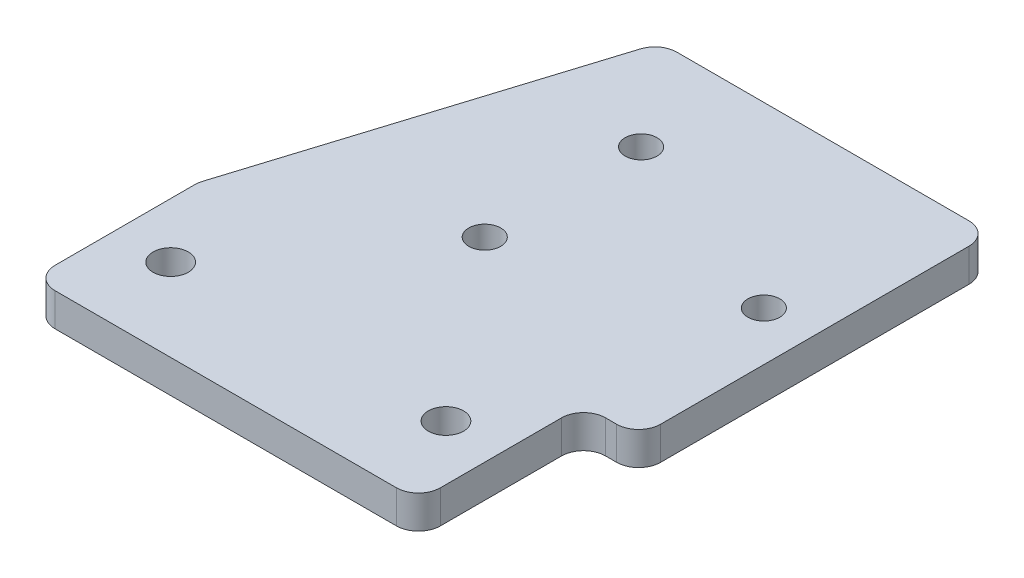
ISO-10303-21;
HEADER;
FILE_DESCRIPTION(('STEP AP214'),'2;1');
FILE_NAME('part.step','',(''),(''),'','','');
FILE_SCHEMA(('AUTOMOTIVE_DESIGN { 1 0 10303 214 1 1 1 1 }'));
ENDSEC;
DATA;
#1=APPLICATION_CONTEXT('core data for automotive mechanical design processes');
#2=APPLICATION_PROTOCOL_DEFINITION('international standard','automotive_design',2000,#1);
#3=PRODUCT_CONTEXT('',#1,'mechanical');
#4=PRODUCT('Part','Part','',(#3));
#5=PRODUCT_RELATED_PRODUCT_CATEGORY('part','',(#4));
#6=PRODUCT_DEFINITION_FORMATION('','',#4);
#7=PRODUCT_DEFINITION_CONTEXT('part definition',#1,'design');
#8=PRODUCT_DEFINITION('design','',#6,#7);
#9=PRODUCT_DEFINITION_SHAPE('','',#8);
#10=(LENGTH_UNIT() NAMED_UNIT(*) SI_UNIT(.MILLI.,.METRE.));
#11=(NAMED_UNIT(*) PLANE_ANGLE_UNIT() SI_UNIT($,.RADIAN.));
#12=(NAMED_UNIT(*) SI_UNIT($,.STERADIAN.) SOLID_ANGLE_UNIT());
#13=UNCERTAINTY_MEASURE_WITH_UNIT(LENGTH_MEASURE(1.E-05),#10,'distance_accuracy_value','');
#14=(GEOMETRIC_REPRESENTATION_CONTEXT(3) GLOBAL_UNCERTAINTY_ASSIGNED_CONTEXT((#13)) GLOBAL_UNIT_ASSIGNED_CONTEXT((#10,
#11,#12)) REPRESENTATION_CONTEXT('',''));
#15=CARTESIAN_POINT('',(0.,0.,0.));
#16=DIRECTION('',(0.,0.,1.));
#17=DIRECTION('',(1.,0.,0.));
#18=AXIS2_PLACEMENT_3D('',#15,#16,#17);
#19=CARTESIAN_POINT('',(0.,3.,0.));
#20=DIRECTION('',(0.,1.,0.));
#21=DIRECTION('',(0.,0.,1.));
#22=AXIS2_PLACEMENT_3D('',#19,#20,#21);
#23=PLANE('',#22);
#24=CARTESIAN_POINT('',(17.3015750443621,3.,-37.9242963081601));
#25=DIRECTION('',(0.,1.,0.));
#26=DIRECTION('',(0.,0.,1.));
#27=AXIS2_PLACEMENT_3D('',#24,#25,#26);
#28=CIRCLE('',#27,1.45);
#29=CARTESIAN_POINT('',(17.3015750443621,3.,-36.4742963081601));
#30=VERTEX_POINT('',#29);
#31=EDGE_CURVE('E332',#30,#30,#28,.T.);
#32=ORIENTED_EDGE('',*,*,#31,.F.);
#33=EDGE_LOOP('',(#32));
#34=FACE_BOUND('',#33,.T.);
#35=CARTESIAN_POINT('',(35.5515750443621,3.,-30.8242963081601));
#36=DIRECTION('',(0.,1.,0.));
#37=DIRECTION('',(0.,0.,1.));
#38=AXIS2_PLACEMENT_3D('',#35,#36,#37);
#39=CIRCLE('',#38,1.45);
#40=CARTESIAN_POINT('',(35.5515750443621,3.,-29.3742963081601));
#41=VERTEX_POINT('',#40);
#42=EDGE_CURVE('E320',#41,#41,#39,.T.);
#43=ORIENTED_EDGE('',*,*,#42,.F.);
#44=EDGE_LOOP('',(#43));
#45=FACE_BOUND('',#44,.T.);
#46=DIRECTION('',(0.,0.,1.));
#47=VECTOR('',#46,1.);
#48=CARTESIAN_POINT('',(0.,3.,0.));
#49=LINE('',#48,#47);
#50=CARTESIAN_POINT('',(0.,3.,-14.6947781543039));
#51=VERTEX_POINT('',#50);
#52=CARTESIAN_POINT('',(0.,3.,-2.));
#53=VERTEX_POINT('',#52);
#54=EDGE_CURVE('E255',#51,#53,#49,.T.);
#55=ORIENTED_EDGE('',*,*,#54,.T.);
#56=CARTESIAN_POINT('',(2.,3.,-2.));
#57=DIRECTION('',(0.,1.,0.));
#58=DIRECTION('',(0.,0.,1.));
#59=AXIS2_PLACEMENT_3D('',#56,#57,#58);
#60=CIRCLE('',#59,2.);
#61=CARTESIAN_POINT('',(2.,3.,0.));
#62=VERTEX_POINT('',#61);
#63=EDGE_CURVE('E200',#53,#62,#60,.T.);
#64=ORIENTED_EDGE('',*,*,#63,.T.);
#65=DIRECTION('',(1.,0.,0.));
#66=VECTOR('',#65,1.);
#67=CARTESIAN_POINT('',(35.,3.,0.));
#68=LINE('',#67,#66);
#69=CARTESIAN_POINT('',(33.,3.,0.));
#70=VERTEX_POINT('',#69);
#71=EDGE_CURVE('E162',#62,#70,#68,.T.);
#72=ORIENTED_EDGE('',*,*,#71,.T.);
#73=CARTESIAN_POINT('',(33.,3.,-2.));
#74=DIRECTION('',(0.,1.,0.));
#75=DIRECTION('',(0.,0.,1.));
#76=AXIS2_PLACEMENT_3D('',#73,#74,#75);
#77=CIRCLE('',#76,2.);
#78=CARTESIAN_POINT('',(35.,3.,-2.));
#79=VERTEX_POINT('',#78);
#80=EDGE_CURVE('E63',#70,#79,#77,.T.);
#81=ORIENTED_EDGE('',*,*,#80,.T.);
#82=DIRECTION('',(0.,0.,-1.));
#83=VECTOR('',#82,1.);
#84=CARTESIAN_POINT('',(35.,3.,-15.));
#85=LINE('',#84,#83);
#86=CARTESIAN_POINT('',(35.,3.,-13.));
#87=VERTEX_POINT('',#86);
#88=EDGE_CURVE('E178',#79,#87,#85,.T.);
#89=ORIENTED_EDGE('',*,*,#88,.T.);
#90=CARTESIAN_POINT('',(37.,3.,-13.));
#91=DIRECTION('',(0.,1.,0.));
#92=DIRECTION('',(0.,0.,1.));
#93=AXIS2_PLACEMENT_3D('',#90,#91,#92);
#94=CIRCLE('',#93,2.);
#95=CARTESIAN_POINT('',(37.,3.,-15.));
#96=VERTEX_POINT('',#95);
#97=EDGE_CURVE('E11',#87,#96,#94,.F.);
#98=ORIENTED_EDGE('',*,*,#97,.T.);
#99=DIRECTION('',(1.,0.,0.));
#100=VECTOR('',#99,1.);
#101=CARTESIAN_POINT('',(40.,3.,-15.));
#102=LINE('',#101,#100);
#103=CARTESIAN_POINT('',(38.,3.,-15.));
#104=VERTEX_POINT('',#103);
#105=EDGE_CURVE('E172',#96,#104,#102,.T.);
#106=ORIENTED_EDGE('',*,*,#105,.T.);
#107=CARTESIAN_POINT('',(38.,3.,-17.));
#108=DIRECTION('',(0.,1.,0.));
#109=DIRECTION('',(0.,0.,1.));
#110=AXIS2_PLACEMENT_3D('',#107,#108,#109);
#111=CIRCLE('',#110,2.);
#112=CARTESIAN_POINT('',(40.,3.,-17.));
#113=VERTEX_POINT('',#112);
#114=EDGE_CURVE('E192',#104,#113,#111,.T.);
#115=ORIENTED_EDGE('',*,*,#114,.T.);
#116=DIRECTION('',(0.,0.,-1.));
#117=VECTOR('',#116,1.);
#118=CARTESIAN_POINT('',(40.,3.,-47.));
#119=LINE('',#118,#117);
#120=CARTESIAN_POINT('',(40.,3.,-45.));
#121=VERTEX_POINT('',#120);
#122=EDGE_CURVE('E241',#113,#121,#119,.T.);
#123=ORIENTED_EDGE('',*,*,#122,.T.);
#124=CARTESIAN_POINT('',(38.,3.,-45.));
#125=DIRECTION('',(0.,1.,0.));
#126=DIRECTION('',(0.,0.,1.));
#127=AXIS2_PLACEMENT_3D('',#124,#125,#126);
#128=CIRCLE('',#127,2.);
#129=CARTESIAN_POINT('',(38.,3.,-47.));
#130=VERTEX_POINT('',#129);
#131=EDGE_CURVE('E194',#121,#130,#128,.T.);
#132=ORIENTED_EDGE('',*,*,#131,.T.);
#133=DIRECTION('',(-1.,0.,0.));
#134=VECTOR('',#133,1.);
#135=CARTESIAN_POINT('',(25.,3.,-47.));
#136=LINE('',#135,#134);
#137=CARTESIAN_POINT('',(11.47038182678,3.,-47.));
#138=VERTEX_POINT('',#137);
#139=EDGE_CURVE('E244',#130,#138,#136,.T.);
#140=ORIENTED_EDGE('',*,*,#139,.T.);
#141=CARTESIAN_POINT('',(11.47038182678,3.,-45.));
#142=DIRECTION('',(0.,1.,0.));
#143=DIRECTION('',(0.,0.,1.));
#144=AXIS2_PLACEMENT_3D('',#141,#142,#143);
#145=CIRCLE('',#144,2.);
#146=CARTESIAN_POINT('',(9.56142187070997,3.,-45.5965499862719));
#147=VERTEX_POINT('',#146);
#148=EDGE_CURVE('E196',#138,#147,#145,.T.);
#149=ORIENTED_EDGE('',*,*,#148,.T.);
#150=DIRECTION('',(-0.298274993135947,0.,0.95447997803503));
#151=VECTOR('',#150,1.);
#152=CARTESIAN_POINT('',(0.,3.,-15.));
#153=LINE('',#152,#151);
#154=CARTESIAN_POINT('',(0.0910400439299408,3.,-15.2913281405758));
#155=VERTEX_POINT('',#154);
#156=EDGE_CURVE('E252',#147,#155,#153,.T.);
#157=ORIENTED_EDGE('',*,*,#156,.T.);
#158=CARTESIAN_POINT('',(2.,3.,-14.6947781543039));
#159=DIRECTION('',(0.,1.,0.));
#160=DIRECTION('',(0.,0.,1.));
#161=AXIS2_PLACEMENT_3D('',#158,#159,#160);
#162=CIRCLE('',#161,2.);
#163=EDGE_CURVE('E198',#155,#51,#162,.T.);
#164=ORIENTED_EDGE('',*,*,#163,.T.);
#165=EDGE_LOOP('',(#55,#64,#72,#81,#89,#98,#106,#115,#123,#132,#140,#149,#157,#164));
#166=FACE_BOUND('',#165,.T.);
#167=CARTESIAN_POINT('',(30.,3.,-7.50000000000001));
#168=DIRECTION('',(0.,1.,0.));
#169=DIRECTION('',(0.,0.,1.));
#170=AXIS2_PLACEMENT_3D('',#167,#168,#169);
#171=CIRCLE('',#170,1.6);
#172=CARTESIAN_POINT('',(30.,3.,-5.90000000000001));
#173=VERTEX_POINT('',#172);
#174=EDGE_CURVE('E261',#173,#173,#171,.T.);
#175=ORIENTED_EDGE('',*,*,#174,.F.);
#176=EDGE_LOOP('',(#175));
#177=FACE_BOUND('',#176,.T.);
#178=CARTESIAN_POINT('',(5.,3.,-7.5));
#179=DIRECTION('',(0.,1.,0.));
#180=DIRECTION('',(0.,0.,-1.));
#181=AXIS2_PLACEMENT_3D('',#178,#179,#180);
#182=CIRCLE('',#181,1.6);
#183=CARTESIAN_POINT('',(5.,3.,-9.1));
#184=VERTEX_POINT('',#183);
#185=EDGE_CURVE('E326',#184,#184,#182,.T.);
#186=ORIENTED_EDGE('',*,*,#185,.F.);
#187=EDGE_LOOP('',(#186));
#188=FACE_BOUND('',#187,.T.);
#189=CARTESIAN_POINT('',(17.3015750443621,3.,-23.7242963081601));
#190=DIRECTION('',(0.,1.,0.));
#191=DIRECTION('',(0.,0.,1.));
#192=AXIS2_PLACEMENT_3D('',#189,#190,#191);
#193=CIRCLE('',#192,1.45);
#194=CARTESIAN_POINT('',(17.3015750443621,3.,-22.2742963081601));
#195=VERTEX_POINT('',#194);
#196=EDGE_CURVE('E338',#195,#195,#193,.T.);
#197=ORIENTED_EDGE('',*,*,#196,.F.);
#198=EDGE_LOOP('',(#197));
#199=FACE_BOUND('',#198,.T.);
#200=ADVANCED_FACE('F41',(#34,#45,#166,#177,#188,#199),#23,.T.);
#201=CARTESIAN_POINT('',(0.,0.,0.));
#202=DIRECTION('',(0.,1.,0.));
#203=DIRECTION('',(0.,0.,1.));
#204=AXIS2_PLACEMENT_3D('',#201,#202,#203);
#205=PLANE('',#204);
#206=DIRECTION('',(1.,0.,0.));
#207=VECTOR('',#206,1.);
#208=CARTESIAN_POINT('',(35.,0.,0.));
#209=LINE('',#208,#207);
#210=CARTESIAN_POINT('',(2.,0.,0.));
#211=VERTEX_POINT('',#210);
#212=CARTESIAN_POINT('',(33.,0.,0.));
#213=VERTEX_POINT('',#212);
#214=EDGE_CURVE('E160',#211,#213,#209,.T.);
#215=ORIENTED_EDGE('',*,*,#214,.F.);
#216=CARTESIAN_POINT('',(2.,0.,-2.));
#217=DIRECTION('',(0.,1.,0.));
#218=DIRECTION('',(0.,0.,1.));
#219=AXIS2_PLACEMENT_3D('',#216,#217,#218);
#220=CIRCLE('',#219,2.);
#221=CARTESIAN_POINT('',(0.,0.,-2.));
#222=VERTEX_POINT('',#221);
#223=EDGE_CURVE('E143',#211,#222,#220,.F.);
#224=ORIENTED_EDGE('',*,*,#223,.T.);
#225=DIRECTION('',(0.,0.,1.));
#226=VECTOR('',#225,1.);
#227=CARTESIAN_POINT('',(0.,0.,0.));
#228=LINE('',#227,#226);
#229=CARTESIAN_POINT('',(0.,0.,-14.6947781543039));
#230=VERTEX_POINT('',#229);
#231=EDGE_CURVE('E170',#230,#222,#228,.T.);
#232=ORIENTED_EDGE('',*,*,#231,.F.);
#233=CARTESIAN_POINT('',(2.,0.,-14.6947781543039));
#234=DIRECTION('',(0.,1.,0.));
#235=DIRECTION('',(0.,0.,1.));
#236=AXIS2_PLACEMENT_3D('',#233,#234,#235);
#237=CIRCLE('',#236,2.);
#238=CARTESIAN_POINT('',(0.0910400439299408,0.,-15.2913281405758));
#239=VERTEX_POINT('',#238);
#240=EDGE_CURVE('E154',#230,#239,#237,.F.);
#241=ORIENTED_EDGE('',*,*,#240,.T.);
#242=DIRECTION('',(-0.298274993135947,0.,0.95447997803503));
#243=VECTOR('',#242,1.);
#244=CARTESIAN_POINT('',(0.,0.,-15.));
#245=LINE('',#244,#243);
#246=CARTESIAN_POINT('',(9.56142187070997,0.,-45.5965499862719));
#247=VERTEX_POINT('',#246);
#248=EDGE_CURVE('E174',#247,#239,#245,.T.);
#249=ORIENTED_EDGE('',*,*,#248,.F.);
#250=CARTESIAN_POINT('',(11.47038182678,0.,-45.));
#251=DIRECTION('',(0.,1.,0.));
#252=DIRECTION('',(0.,0.,1.));
#253=AXIS2_PLACEMENT_3D('',#250,#251,#252);
#254=CIRCLE('',#253,2.);
#255=CARTESIAN_POINT('',(11.47038182678,0.,-47.));
#256=VERTEX_POINT('',#255);
#257=EDGE_CURVE('E185',#247,#256,#254,.F.);
#258=ORIENTED_EDGE('',*,*,#257,.T.);
#259=DIRECTION('',(-1.,0.,0.));
#260=VECTOR('',#259,1.);
#261=CARTESIAN_POINT('',(10.,0.,-47.));
#262=LINE('',#261,#260);
#263=CARTESIAN_POINT('',(38.,0.,-47.));
#264=VERTEX_POINT('',#263);
#265=EDGE_CURVE('E264',#264,#256,#262,.T.);
#266=ORIENTED_EDGE('',*,*,#265,.F.);
#267=CARTESIAN_POINT('',(38.,0.,-45.));
#268=DIRECTION('',(0.,1.,0.));
#269=DIRECTION('',(0.,0.,1.));
#270=AXIS2_PLACEMENT_3D('',#267,#268,#269);
#271=CIRCLE('',#270,2.);
#272=CARTESIAN_POINT('',(40.,0.,-45.));
#273=VERTEX_POINT('',#272);
#274=EDGE_CURVE('E183',#264,#273,#271,.F.);
#275=ORIENTED_EDGE('',*,*,#274,.T.);
#276=DIRECTION('',(0.,0.,-1.));
#277=VECTOR('',#276,1.);
#278=CARTESIAN_POINT('',(40.,0.,-47.));
#279=LINE('',#278,#277);
#280=CARTESIAN_POINT('',(40.,0.,-17.));
#281=VERTEX_POINT('',#280);
#282=EDGE_CURVE('E260',#281,#273,#279,.T.);
#283=ORIENTED_EDGE('',*,*,#282,.F.);
#284=CARTESIAN_POINT('',(38.,0.,-17.));
#285=DIRECTION('',(0.,1.,0.));
#286=DIRECTION('',(0.,0.,1.));
#287=AXIS2_PLACEMENT_3D('',#284,#285,#286);
#288=CIRCLE('',#287,2.);
#289=CARTESIAN_POINT('',(38.,0.,-15.));
#290=VERTEX_POINT('',#289);
#291=EDGE_CURVE('E181',#281,#290,#288,.F.);
#292=ORIENTED_EDGE('',*,*,#291,.T.);
#293=DIRECTION('',(1.,0.,0.));
#294=VECTOR('',#293,1.);
#295=CARTESIAN_POINT('',(40.,0.,-15.));
#296=LINE('',#295,#294);
#297=CARTESIAN_POINT('',(37.,0.,-15.));
#298=VERTEX_POINT('',#297);
#299=EDGE_CURVE('E227',#298,#290,#296,.T.);
#300=ORIENTED_EDGE('',*,*,#299,.F.);
#301=CARTESIAN_POINT('',(37.,0.,-13.));
#302=DIRECTION('',(0.,1.,0.));
#303=DIRECTION('',(0.,0.,1.));
#304=AXIS2_PLACEMENT_3D('',#301,#302,#303);
#305=CIRCLE('',#304,2.);
#306=CARTESIAN_POINT('',(35.,0.,-13.));
#307=VERTEX_POINT('',#306);
#308=EDGE_CURVE('E49',#298,#307,#305,.T.);
#309=ORIENTED_EDGE('',*,*,#308,.T.);
#310=DIRECTION('',(0.,0.,-1.));
#311=VECTOR('',#310,1.);
#312=CARTESIAN_POINT('',(35.,0.,-15.));
#313=LINE('',#312,#311);
#314=CARTESIAN_POINT('',(35.,0.,-2.));
#315=VERTEX_POINT('',#314);
#316=EDGE_CURVE('E169',#315,#307,#313,.T.);
#317=ORIENTED_EDGE('',*,*,#316,.F.);
#318=CARTESIAN_POINT('',(33.,0.,-2.));
#319=DIRECTION('',(0.,1.,0.));
#320=DIRECTION('',(0.,0.,1.));
#321=AXIS2_PLACEMENT_3D('',#318,#319,#320);
#322=CIRCLE('',#321,2.);
#323=EDGE_CURVE('E163',#315,#213,#322,.F.);
#324=ORIENTED_EDGE('',*,*,#323,.T.);
#325=EDGE_LOOP('',(#215,#224,#232,#241,#249,#258,#266,#275,#283,#292,#300,#309,#317,#324));
#326=FACE_BOUND('',#325,.T.);
#327=CARTESIAN_POINT('',(30.,0.,-7.50000000000001));
#328=DIRECTION('',(0.,1.,0.));
#329=DIRECTION('',(0.,0.,1.));
#330=AXIS2_PLACEMENT_3D('',#327,#328,#329);
#331=CIRCLE('',#330,1.6);
#332=CARTESIAN_POINT('',(30.,0.,-5.90000000000001));
#333=VERTEX_POINT('',#332);
#334=EDGE_CURVE('E247',#333,#333,#331,.T.);
#335=ORIENTED_EDGE('',*,*,#334,.T.);
#336=EDGE_LOOP('',(#335));
#337=FACE_BOUND('',#336,.T.);
#338=CARTESIAN_POINT('',(35.5515750443621,0.,-30.8242963081601));
#339=DIRECTION('',(0.,1.,0.));
#340=DIRECTION('',(0.,0.,1.));
#341=AXIS2_PLACEMENT_3D('',#338,#339,#340);
#342=CIRCLE('',#341,1.45);
#343=CARTESIAN_POINT('',(35.5515750443621,0.,-29.3742963081601));
#344=VERTEX_POINT('',#343);
#345=EDGE_CURVE('E322',#344,#344,#342,.T.);
#346=ORIENTED_EDGE('',*,*,#345,.T.);
#347=EDGE_LOOP('',(#346));
#348=FACE_BOUND('',#347,.T.);
#349=CARTESIAN_POINT('',(5.,0.,-7.5));
#350=DIRECTION('',(0.,1.,0.));
#351=DIRECTION('',(0.,0.,-1.));
#352=AXIS2_PLACEMENT_3D('',#349,#350,#351);
#353=CIRCLE('',#352,1.6);
#354=CARTESIAN_POINT('',(5.,0.,-9.1));
#355=VERTEX_POINT('',#354);
#356=EDGE_CURVE('E329',#355,#355,#353,.T.);
#357=ORIENTED_EDGE('',*,*,#356,.T.);
#358=EDGE_LOOP('',(#357));
#359=FACE_BOUND('',#358,.T.);
#360=CARTESIAN_POINT('',(17.3015750443621,0.,-37.9242963081601));
#361=DIRECTION('',(0.,1.,0.));
#362=DIRECTION('',(0.,0.,1.));
#363=AXIS2_PLACEMENT_3D('',#360,#361,#362);
#364=CIRCLE('',#363,1.45);
#365=CARTESIAN_POINT('',(17.3015750443621,0.,-36.4742963081601));
#366=VERTEX_POINT('',#365);
#367=EDGE_CURVE('E335',#366,#366,#364,.T.);
#368=ORIENTED_EDGE('',*,*,#367,.T.);
#369=EDGE_LOOP('',(#368));
#370=FACE_BOUND('',#369,.T.);
#371=CARTESIAN_POINT('',(17.3015750443621,0.,-23.7242963081601));
#372=DIRECTION('',(0.,1.,0.));
#373=DIRECTION('',(0.,0.,1.));
#374=AXIS2_PLACEMENT_3D('',#371,#372,#373);
#375=CIRCLE('',#374,1.45);
#376=CARTESIAN_POINT('',(17.3015750443621,0.,-22.2742963081601));
#377=VERTEX_POINT('',#376);
#378=EDGE_CURVE('E341',#377,#377,#375,.T.);
#379=ORIENTED_EDGE('',*,*,#378,.T.);
#380=EDGE_LOOP('',(#379));
#381=FACE_BOUND('',#380,.T.);
#382=ADVANCED_FACE('F166',(#326,#337,#348,#359,#370,#381),#205,.F.);
#383=CARTESIAN_POINT('',(40.,3.,-15.));
#384=DIRECTION('',(0.,0.,-1.));
#385=DIRECTION('',(-1.,0.,0.));
#386=AXIS2_PLACEMENT_3D('',#383,#384,#385);
#387=PLANE('',#386);
#388=ORIENTED_EDGE('',*,*,#299,.T.);
#389=DIRECTION('',(0.,-1.,0.));
#390=VECTOR('',#389,1.);
#391=CARTESIAN_POINT('',(38.,3.,-15.));
#392=LINE('',#391,#390);
#393=EDGE_CURVE('E220',#290,#104,#392,.F.);
#394=ORIENTED_EDGE('',*,*,#393,.T.);
#395=ORIENTED_EDGE('',*,*,#105,.F.);
#396=DIRECTION('',(0.,-1.,0.));
#397=VECTOR('',#396,1.);
#398=CARTESIAN_POINT('',(37.,0.,-15.));
#399=LINE('',#398,#397);
#400=EDGE_CURVE('E217',#96,#298,#399,.T.);
#401=ORIENTED_EDGE('',*,*,#400,.T.);
#402=EDGE_LOOP('',(#388,#394,#395,#401));
#403=FACE_BOUND('',#402,.T.);
#404=ADVANCED_FACE('F239',(#403),#387,.F.);
#405=CARTESIAN_POINT('',(40.,3.,-47.));
#406=DIRECTION('',(-1.,0.,0.));
#407=DIRECTION('',(0.,0.,1.));
#408=AXIS2_PLACEMENT_3D('',#405,#406,#407);
#409=PLANE('',#408);
#410=ORIENTED_EDGE('',*,*,#282,.T.);
#411=DIRECTION('',(0.,-1.,0.));
#412=VECTOR('',#411,1.);
#413=CARTESIAN_POINT('',(40.,3.,-45.));
#414=LINE('',#413,#412);
#415=EDGE_CURVE('E215',#273,#121,#414,.F.);
#416=ORIENTED_EDGE('',*,*,#415,.T.);
#417=ORIENTED_EDGE('',*,*,#122,.F.);
#418=DIRECTION('',(0.,-1.,0.));
#419=VECTOR('',#418,1.);
#420=CARTESIAN_POINT('',(40.,3.,-17.));
#421=LINE('',#420,#419);
#422=EDGE_CURVE('E212',#113,#281,#421,.T.);
#423=ORIENTED_EDGE('',*,*,#422,.T.);
#424=EDGE_LOOP('',(#410,#416,#417,#423));
#425=FACE_BOUND('',#424,.T.);
#426=ADVANCED_FACE('F451',(#425),#409,.F.);
#427=CARTESIAN_POINT('',(10.,3.,-47.));
#428=DIRECTION('',(0.,0.,1.));
#429=DIRECTION('',(1.,0.,0.));
#430=AXIS2_PLACEMENT_3D('',#427,#428,#429);
#431=PLANE('',#430);
#432=ORIENTED_EDGE('',*,*,#265,.T.);
#433=DIRECTION('',(0.,-1.,0.));
#434=VECTOR('',#433,1.);
#435=CARTESIAN_POINT('',(11.47038182678,3.,-47.));
#436=LINE('',#435,#434);
#437=EDGE_CURVE('E210',#256,#138,#436,.F.);
#438=ORIENTED_EDGE('',*,*,#437,.T.);
#439=ORIENTED_EDGE('',*,*,#139,.F.);
#440=DIRECTION('',(0.,-1.,0.));
#441=VECTOR('',#440,1.);
#442=CARTESIAN_POINT('',(38.,3.,-47.));
#443=LINE('',#442,#441);
#444=EDGE_CURVE('E207',#130,#264,#443,.T.);
#445=ORIENTED_EDGE('',*,*,#444,.T.);
#446=EDGE_LOOP('',(#432,#438,#439,#445));
#447=FACE_BOUND('',#446,.T.);
#448=ADVANCED_FACE('F287',(#447),#431,.F.);
#449=CARTESIAN_POINT('',(0.,3.,-15.));
#450=DIRECTION('',(0.95447997803503,0.,0.298274993135947));
#451=DIRECTION('',(0.298274993135947,0.,-0.95447997803503));
#452=AXIS2_PLACEMENT_3D('',#449,#450,#451);
#453=PLANE('',#452);
#454=ORIENTED_EDGE('',*,*,#248,.T.);
#455=DIRECTION('',(0.,-1.,0.));
#456=VECTOR('',#455,1.);
#457=CARTESIAN_POINT('',(0.0910400439299407,3.,-15.2913281405758));
#458=LINE('',#457,#456);
#459=EDGE_CURVE('E205',#239,#155,#458,.F.);
#460=ORIENTED_EDGE('',*,*,#459,.T.);
#461=ORIENTED_EDGE('',*,*,#156,.F.);
#462=DIRECTION('',(0.,-1.,0.));
#463=VECTOR('',#462,1.);
#464=CARTESIAN_POINT('',(9.56142187070997,3.,-45.5965499862719));
#465=LINE('',#464,#463);
#466=EDGE_CURVE('E202',#147,#247,#465,.T.);
#467=ORIENTED_EDGE('',*,*,#466,.T.);
#468=EDGE_LOOP('',(#454,#460,#461,#467));
#469=FACE_BOUND('',#468,.T.);
#470=ADVANCED_FACE('F270',(#469),#453,.F.);
#471=CARTESIAN_POINT('',(0.,3.,0.));
#472=DIRECTION('',(1.,0.,0.));
#473=DIRECTION('',(0.,0.,-1.));
#474=AXIS2_PLACEMENT_3D('',#471,#472,#473);
#475=PLANE('',#474);
#476=ORIENTED_EDGE('',*,*,#231,.T.);
#477=DIRECTION('',(0.,-1.,0.));
#478=VECTOR('',#477,1.);
#479=CARTESIAN_POINT('',(0.,3.,-2.));
#480=LINE('',#479,#478);
#481=EDGE_CURVE('E148',#222,#53,#480,.F.);
#482=ORIENTED_EDGE('',*,*,#481,.T.);
#483=ORIENTED_EDGE('',*,*,#54,.F.);
#484=DIRECTION('',(0.,-1.,0.));
#485=VECTOR('',#484,1.);
#486=CARTESIAN_POINT('',(0.,3.,-14.6947781543039));
#487=LINE('',#486,#485);
#488=EDGE_CURVE('E153',#51,#230,#487,.T.);
#489=ORIENTED_EDGE('',*,*,#488,.T.);
#490=EDGE_LOOP('',(#476,#482,#483,#489));
#491=FACE_BOUND('',#490,.T.);
#492=ADVANCED_FACE('F279',(#491),#475,.F.);
#493=CARTESIAN_POINT('',(35.,3.,0.));
#494=DIRECTION('',(0.,0.,-1.));
#495=DIRECTION('',(-1.,0.,0.));
#496=AXIS2_PLACEMENT_3D('',#493,#494,#495);
#497=PLANE('',#496);
#498=ORIENTED_EDGE('',*,*,#71,.F.);
#499=DIRECTION('',(0.,-1.,0.));
#500=VECTOR('',#499,1.);
#501=CARTESIAN_POINT('',(2.,3.,0.));
#502=LINE('',#501,#500);
#503=EDGE_CURVE('E147',#62,#211,#502,.T.);
#504=ORIENTED_EDGE('',*,*,#503,.T.);
#505=ORIENTED_EDGE('',*,*,#214,.T.);
#506=DIRECTION('',(0.,-1.,0.));
#507=VECTOR('',#506,1.);
#508=CARTESIAN_POINT('',(33.,3.,0.));
#509=LINE('',#508,#507);
#510=EDGE_CURVE('E164',#213,#70,#509,.F.);
#511=ORIENTED_EDGE('',*,*,#510,.T.);
#512=EDGE_LOOP('',(#498,#504,#505,#511));
#513=FACE_BOUND('',#512,.T.);
#514=ADVANCED_FACE('F159',(#513),#497,.F.);
#515=CARTESIAN_POINT('',(35.,3.,-15.));
#516=DIRECTION('',(-1.,0.,0.));
#517=DIRECTION('',(0.,0.,1.));
#518=AXIS2_PLACEMENT_3D('',#515,#516,#517);
#519=PLANE('',#518);
#520=ORIENTED_EDGE('',*,*,#88,.F.);
#521=DIRECTION('',(0.,-1.,0.));
#522=VECTOR('',#521,1.);
#523=CARTESIAN_POINT('',(35.,3.,-2.));
#524=LINE('',#523,#522);
#525=EDGE_CURVE('E223',#79,#315,#524,.T.);
#526=ORIENTED_EDGE('',*,*,#525,.T.);
#527=ORIENTED_EDGE('',*,*,#316,.T.);
#528=DIRECTION('',(0.,-1.,0.));
#529=VECTOR('',#528,1.);
#530=CARTESIAN_POINT('',(35.,3.,-13.));
#531=LINE('',#530,#529);
#532=EDGE_CURVE('E56',#307,#87,#531,.F.);
#533=ORIENTED_EDGE('',*,*,#532,.T.);
#534=EDGE_LOOP('',(#520,#526,#527,#533));
#535=FACE_BOUND('',#534,.T.);
#536=ADVANCED_FACE('F230',(#535),#519,.F.);
#537=CARTESIAN_POINT('',(30.,3.,-7.50000000000001));
#538=DIRECTION('',(0.,-1.,0.));
#539=DIRECTION('',(0.,0.,-1.));
#540=AXIS2_PLACEMENT_3D('',#537,#538,#539);
#541=CYLINDRICAL_SURFACE('',#540,1.6);
#542=ORIENTED_EDGE('',*,*,#174,.T.);
#543=EDGE_LOOP('',(#542));
#544=FACE_BOUND('',#543,.T.);
#545=ORIENTED_EDGE('',*,*,#334,.F.);
#546=EDGE_LOOP('',(#545));
#547=FACE_BOUND('',#546,.T.);
#548=ADVANCED_FACE('F300',(#544,#547),#541,.F.);
#549=CARTESIAN_POINT('',(35.5515750443621,3.,-30.8242963081601));
#550=DIRECTION('',(0.,-1.,0.));
#551=DIRECTION('',(0.,0.,-1.));
#552=AXIS2_PLACEMENT_3D('',#549,#550,#551);
#553=CYLINDRICAL_SURFACE('',#552,1.45);
#554=ORIENTED_EDGE('',*,*,#42,.T.);
#555=EDGE_LOOP('',(#554));
#556=FACE_BOUND('',#555,.T.);
#557=ORIENTED_EDGE('',*,*,#345,.F.);
#558=EDGE_LOOP('',(#557));
#559=FACE_BOUND('',#558,.T.);
#560=ADVANCED_FACE('F308',(#556,#559),#553,.F.);
#561=CARTESIAN_POINT('',(5.,3.,-7.5));
#562=DIRECTION('',(0.,-1.,0.));
#563=DIRECTION('',(0.,0.,-1.));
#564=AXIS2_PLACEMENT_3D('',#561,#562,#563);
#565=CYLINDRICAL_SURFACE('',#564,1.6);
#566=ORIENTED_EDGE('',*,*,#185,.T.);
#567=EDGE_LOOP('',(#566));
#568=FACE_BOUND('',#567,.T.);
#569=ORIENTED_EDGE('',*,*,#356,.F.);
#570=EDGE_LOOP('',(#569));
#571=FACE_BOUND('',#570,.T.);
#572=ADVANCED_FACE('F313',(#568,#571),#565,.F.);
#573=CARTESIAN_POINT('',(17.3015750443621,3.,-37.9242963081601));
#574=DIRECTION('',(0.,-1.,0.));
#575=DIRECTION('',(0.,0.,-1.));
#576=AXIS2_PLACEMENT_3D('',#573,#574,#575);
#577=CYLINDRICAL_SURFACE('',#576,1.45);
#578=ORIENTED_EDGE('',*,*,#31,.T.);
#579=EDGE_LOOP('',(#578));
#580=FACE_BOUND('',#579,.T.);
#581=ORIENTED_EDGE('',*,*,#367,.F.);
#582=EDGE_LOOP('',(#581));
#583=FACE_BOUND('',#582,.T.);
#584=ADVANCED_FACE('F350',(#580,#583),#577,.F.);
#585=CARTESIAN_POINT('',(17.3015750443621,3.,-23.7242963081601));
#586=DIRECTION('',(0.,-1.,0.));
#587=DIRECTION('',(0.,0.,-1.));
#588=AXIS2_PLACEMENT_3D('',#585,#586,#587);
#589=CYLINDRICAL_SURFACE('',#588,1.45);
#590=ORIENTED_EDGE('',*,*,#196,.T.);
#591=EDGE_LOOP('',(#590));
#592=FACE_BOUND('',#591,.T.);
#593=ORIENTED_EDGE('',*,*,#378,.F.);
#594=EDGE_LOOP('',(#593));
#595=FACE_BOUND('',#594,.T.);
#596=ADVANCED_FACE('F347',(#592,#595),#589,.F.);
#597=CARTESIAN_POINT('',(2.,3.,-2.));
#598=DIRECTION('',(0.,-1.,0.));
#599=DIRECTION('',(0.,0.,-1.));
#600=AXIS2_PLACEMENT_3D('',#597,#598,#599);
#601=CYLINDRICAL_SURFACE('',#600,2.);
#602=ORIENTED_EDGE('',*,*,#63,.F.);
#603=ORIENTED_EDGE('',*,*,#481,.F.);
#604=ORIENTED_EDGE('',*,*,#223,.F.);
#605=ORIENTED_EDGE('',*,*,#503,.F.);
#606=EDGE_LOOP('',(#602,#603,#604,#605));
#607=FACE_BOUND('',#606,.T.);
#608=ADVANCED_FACE('F146',(#607),#601,.T.);
#609=CARTESIAN_POINT('',(2.,3.,-14.6947781543039));
#610=DIRECTION('',(0.,-1.,0.));
#611=DIRECTION('',(0.,0.,-1.));
#612=AXIS2_PLACEMENT_3D('',#609,#610,#611);
#613=CYLINDRICAL_SURFACE('',#612,2.);
#614=ORIENTED_EDGE('',*,*,#163,.F.);
#615=ORIENTED_EDGE('',*,*,#459,.F.);
#616=ORIENTED_EDGE('',*,*,#240,.F.);
#617=ORIENTED_EDGE('',*,*,#488,.F.);
#618=EDGE_LOOP('',(#614,#615,#616,#617));
#619=FACE_BOUND('',#618,.T.);
#620=ADVANCED_FACE('F275',(#619),#613,.T.);
#621=CARTESIAN_POINT('',(11.47038182678,3.,-45.));
#622=DIRECTION('',(0.,-1.,0.));
#623=DIRECTION('',(0.,0.,-1.));
#624=AXIS2_PLACEMENT_3D('',#621,#622,#623);
#625=CYLINDRICAL_SURFACE('',#624,2.);
#626=ORIENTED_EDGE('',*,*,#148,.F.);
#627=ORIENTED_EDGE('',*,*,#437,.F.);
#628=ORIENTED_EDGE('',*,*,#257,.F.);
#629=ORIENTED_EDGE('',*,*,#466,.F.);
#630=EDGE_LOOP('',(#626,#627,#628,#629));
#631=FACE_BOUND('',#630,.T.);
#632=ADVANCED_FACE('F400',(#631),#625,.T.);
#633=CARTESIAN_POINT('',(38.,3.,-45.));
#634=DIRECTION('',(0.,-1.,0.));
#635=DIRECTION('',(0.,0.,-1.));
#636=AXIS2_PLACEMENT_3D('',#633,#634,#635);
#637=CYLINDRICAL_SURFACE('',#636,2.);
#638=ORIENTED_EDGE('',*,*,#131,.F.);
#639=ORIENTED_EDGE('',*,*,#415,.F.);
#640=ORIENTED_EDGE('',*,*,#274,.F.);
#641=ORIENTED_EDGE('',*,*,#444,.F.);
#642=EDGE_LOOP('',(#638,#639,#640,#641));
#643=FACE_BOUND('',#642,.T.);
#644=ADVANCED_FACE('F409',(#643),#637,.T.);
#645=CARTESIAN_POINT('',(38.,3.,-17.));
#646=DIRECTION('',(0.,-1.,0.));
#647=DIRECTION('',(0.,0.,-1.));
#648=AXIS2_PLACEMENT_3D('',#645,#646,#647);
#649=CYLINDRICAL_SURFACE('',#648,2.);
#650=ORIENTED_EDGE('',*,*,#114,.F.);
#651=ORIENTED_EDGE('',*,*,#393,.F.);
#652=ORIENTED_EDGE('',*,*,#291,.F.);
#653=ORIENTED_EDGE('',*,*,#422,.F.);
#654=EDGE_LOOP('',(#650,#651,#652,#653));
#655=FACE_BOUND('',#654,.T.);
#656=ADVANCED_FACE('F419',(#655),#649,.T.);
#657=CARTESIAN_POINT('',(33.,3.,-2.));
#658=DIRECTION('',(0.,-1.,0.));
#659=DIRECTION('',(0.,0.,-1.));
#660=AXIS2_PLACEMENT_3D('',#657,#658,#659);
#661=CYLINDRICAL_SURFACE('',#660,2.);
#662=ORIENTED_EDGE('',*,*,#80,.F.);
#663=ORIENTED_EDGE('',*,*,#510,.F.);
#664=ORIENTED_EDGE('',*,*,#323,.F.);
#665=ORIENTED_EDGE('',*,*,#525,.F.);
#666=EDGE_LOOP('',(#662,#663,#664,#665));
#667=FACE_BOUND('',#666,.T.);
#668=ADVANCED_FACE('F429',(#667),#661,.T.);
#669=CARTESIAN_POINT('',(37.,3.,-13.));
#670=DIRECTION('',(0.,1.,0.));
#671=DIRECTION('',(0.,0.,1.));
#672=AXIS2_PLACEMENT_3D('',#669,#670,#671);
#673=CYLINDRICAL_SURFACE('',#672,2.);
#674=ORIENTED_EDGE('',*,*,#97,.F.);
#675=ORIENTED_EDGE('',*,*,#532,.F.);
#676=ORIENTED_EDGE('',*,*,#308,.F.);
#677=ORIENTED_EDGE('',*,*,#400,.F.);
#678=EDGE_LOOP('',(#674,#675,#676,#677));
#679=FACE_BOUND('',#678,.T.);
#680=ADVANCED_FACE('F43',(#679),#673,.F.);
#681=CLOSED_SHELL('',(#200,#382,#404,#426,#448,#470,#492,#514,#536,#548,#560,#572,#584,#596,
#608,#620,#632,#644,#656,#668,#680));
#682=MANIFOLD_SOLID_BREP('B2',#681);
#683=ADVANCED_BREP_SHAPE_REPRESENTATION('',(#18,#682),#14);
#684=SHAPE_DEFINITION_REPRESENTATION(#9,#683);
ENDSEC;
END-ISO-10303-21;
